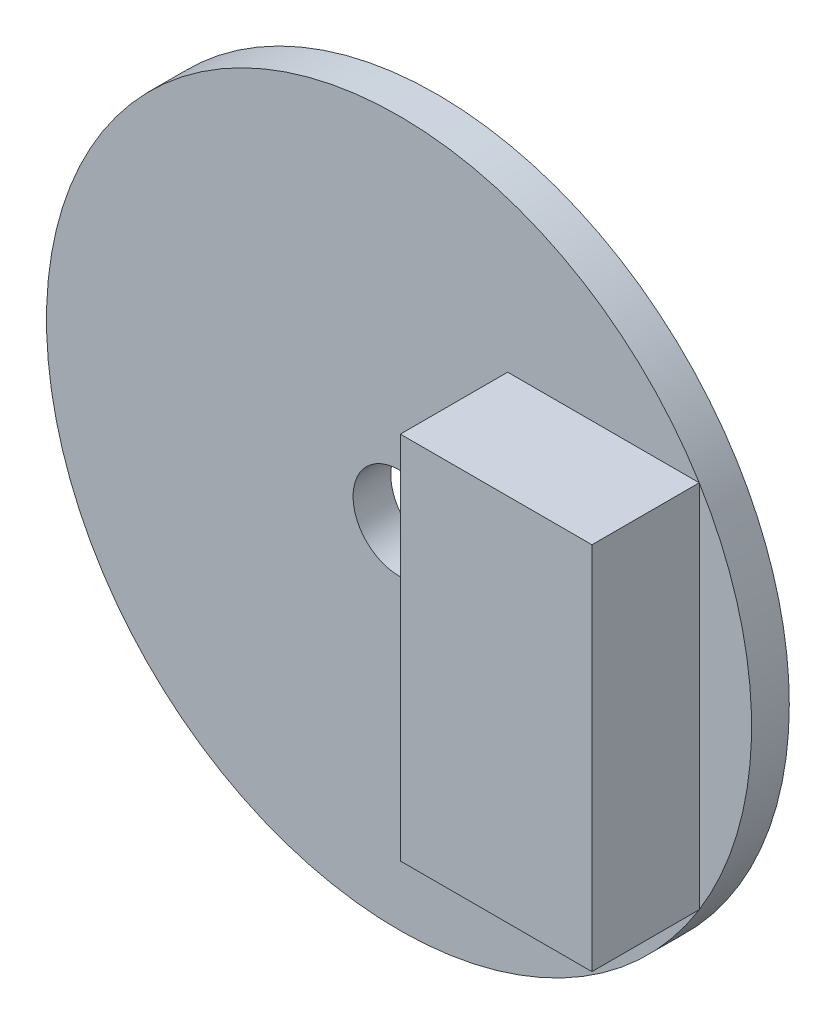
ISO-10303-21;
HEADER;
FILE_DESCRIPTION(('STEP AP214'),'2;1');
FILE_NAME('part.step','',(''),(''),'','','');
FILE_SCHEMA(('AUTOMOTIVE_DESIGN { 1 0 10303 214 1 1 1 1 }'));
ENDSEC;
DATA;
#1=APPLICATION_CONTEXT('core data for automotive mechanical design processes');
#2=APPLICATION_PROTOCOL_DEFINITION('international standard','automotive_design',2000,#1);
#3=PRODUCT_CONTEXT('',#1,'mechanical');
#4=PRODUCT('Part','Part','',(#3));
#5=PRODUCT_RELATED_PRODUCT_CATEGORY('part','',(#4));
#6=PRODUCT_DEFINITION_FORMATION('','',#4);
#7=PRODUCT_DEFINITION_CONTEXT('part definition',#1,'design');
#8=PRODUCT_DEFINITION('design','',#6,#7);
#9=PRODUCT_DEFINITION_SHAPE('','',#8);
#10=(LENGTH_UNIT() NAMED_UNIT(*) SI_UNIT(.MILLI.,.METRE.));
#11=(NAMED_UNIT(*) PLANE_ANGLE_UNIT() SI_UNIT($,.RADIAN.));
#12=(NAMED_UNIT(*) SI_UNIT($,.STERADIAN.) SOLID_ANGLE_UNIT());
#13=UNCERTAINTY_MEASURE_WITH_UNIT(LENGTH_MEASURE(1.E-05),#10,'distance_accuracy_value','');
#14=(GEOMETRIC_REPRESENTATION_CONTEXT(3) GLOBAL_UNCERTAINTY_ASSIGNED_CONTEXT((#13)) GLOBAL_UNIT_ASSIGNED_CONTEXT((#10,
#11,#12)) REPRESENTATION_CONTEXT('',''));
#15=CARTESIAN_POINT('',(0.,0.,0.));
#16=DIRECTION('',(0.,0.,1.));
#17=DIRECTION('',(1.,0.,0.));
#18=AXIS2_PLACEMENT_3D('',#15,#16,#17);
#19=CARTESIAN_POINT('',(0.,0.,1.23));
#20=DIRECTION('',(0.,0.,1.));
#21=DIRECTION('',(1.,0.,0.));
#22=AXIS2_PLACEMENT_3D('',#19,#20,#21);
#23=PLANE('',#22);
#24=DIRECTION('',(0.,1.,0.));
#25=VECTOR('',#24,1.);
#26=CARTESIAN_POINT('',(9.79248184895356,6.02970142195408,1.23));
#27=LINE('',#26,#25);
#28=CARTESIAN_POINT('',(9.79248184895356,-6.02970142195408,1.23));
#29=VERTEX_POINT('',#28);
#30=CARTESIAN_POINT('',(9.79248184895356,6.02970142195408,1.23));
#31=VERTEX_POINT('',#30);
#32=EDGE_CURVE('E54',#29,#31,#27,.T.);
#33=ORIENTED_EDGE('',*,*,#32,.F.);
#34=CARTESIAN_POINT('',(0.,0.,1.23));
#35=DIRECTION('',(0.,0.,1.));
#36=DIRECTION('',(1.,0.,0.));
#37=AXIS2_PLACEMENT_3D('',#34,#35,#36);
#38=CIRCLE('',#37,11.5);
#39=EDGE_CURVE('E41',#29,#31,#38,.T.);
#40=ORIENTED_EDGE('',*,*,#39,.T.);
#41=EDGE_LOOP('',(#33,#40));
#42=FACE_BOUND('',#41,.T.);
#43=ADVANCED_FACE('F32',(#42),#23,.T.);
#44=CARTESIAN_POINT('',(0.,0.,1.23));
#45=DIRECTION('',(0.,0.,-1.));
#46=DIRECTION('',(-1.,0.,0.));
#47=AXIS2_PLACEMENT_3D('',#44,#45,#46);
#48=CYLINDRICAL_SURFACE('',#47,11.5);
#49=EDGE_CURVE('E11',#31,#29,#38,.T.);
#50=ORIENTED_EDGE('',*,*,#49,.F.);
#51=ORIENTED_EDGE('',*,*,#39,.F.);
#52=EDGE_LOOP('',(#50,#51));
#53=FACE_BOUND('',#52,.T.);
#54=CARTESIAN_POINT('',(0.,0.,0.));
#55=DIRECTION('',(0.,0.,1.));
#56=DIRECTION('',(1.,0.,0.));
#57=AXIS2_PLACEMENT_3D('',#54,#55,#56);
#58=CIRCLE('',#57,11.5);
#59=CARTESIAN_POINT('',(11.5,0.,0.));
#60=VERTEX_POINT('',#59);
#61=EDGE_CURVE('E36',#60,#60,#58,.T.);
#62=ORIENTED_EDGE('',*,*,#61,.T.);
#63=EDGE_LOOP('',(#62));
#64=FACE_BOUND('',#63,.T.);
#65=ADVANCED_FACE('F34',(#53,#64),#48,.T.);
#66=CARTESIAN_POINT('',(0.,0.,1.23));
#67=DIRECTION('',(0.,0.,1.));
#68=DIRECTION('',(1.,0.,0.));
#69=AXIS2_PLACEMENT_3D('',#66,#67,#68);
#70=CIRCLE('',#69,1.5);
#71=CARTESIAN_POINT('',(1.5,0.,1.23));
#72=VERTEX_POINT('',#71);
#73=EDGE_CURVE('E115',#72,#72,#70,.T.);
#74=ORIENTED_EDGE('',*,*,#73,.F.);
#75=EDGE_LOOP('',(#74));
#76=FACE_BOUND('',#75,.T.);
#77=DIRECTION('',(1.,0.,0.));
#78=VECTOR('',#77,1.);
#79=CARTESIAN_POINT('',(9.79248184895356,-6.02970142195408,1.23));
#80=LINE('',#79,#78);
#81=CARTESIAN_POINT('',(3.54248184895356,-6.02970142195408,1.23));
#82=VERTEX_POINT('',#81);
#83=EDGE_CURVE('E47',#82,#29,#80,.T.);
#84=ORIENTED_EDGE('',*,*,#83,.F.);
#85=DIRECTION('',(0.,-1.,0.));
#86=VECTOR('',#85,1.);
#87=CARTESIAN_POINT('',(3.54248184895356,6.02970142195408,1.23));
#88=LINE('',#87,#86);
#89=CARTESIAN_POINT('',(3.54248184895356,6.02970142195408,1.23));
#90=VERTEX_POINT('',#89);
#91=EDGE_CURVE('E107',#90,#82,#88,.T.);
#92=ORIENTED_EDGE('',*,*,#91,.F.);
#93=DIRECTION('',(-1.,0.,0.));
#94=VECTOR('',#93,1.);
#95=CARTESIAN_POINT('',(9.79248184895356,6.02970142195408,1.23));
#96=LINE('',#95,#94);
#97=EDGE_CURVE('E109',#31,#90,#96,.T.);
#98=ORIENTED_EDGE('',*,*,#97,.F.);
#99=ORIENTED_EDGE('',*,*,#49,.T.);
#100=EDGE_LOOP('',(#84,#92,#98,#99));
#101=FACE_BOUND('',#100,.T.);
#102=ADVANCED_FACE('F130',(#76,#101),#23,.T.);
#103=CARTESIAN_POINT('',(0.,0.,0.));
#104=DIRECTION('',(0.,0.,1.));
#105=DIRECTION('',(1.,0.,0.));
#106=AXIS2_PLACEMENT_3D('',#103,#104,#105);
#107=PLANE('',#106);
#108=CARTESIAN_POINT('',(0.,0.,0.));
#109=DIRECTION('',(0.,0.,1.));
#110=DIRECTION('',(1.,0.,0.));
#111=AXIS2_PLACEMENT_3D('',#108,#109,#110);
#112=CIRCLE('',#111,1.5);
#113=CARTESIAN_POINT('',(1.5,0.,0.));
#114=VERTEX_POINT('',#113);
#115=EDGE_CURVE('E112',#114,#114,#112,.T.);
#116=ORIENTED_EDGE('',*,*,#115,.T.);
#117=EDGE_LOOP('',(#116));
#118=FACE_BOUND('',#117,.T.);
#119=ORIENTED_EDGE('',*,*,#61,.F.);
#120=EDGE_LOOP('',(#119));
#121=FACE_BOUND('',#120,.T.);
#122=ADVANCED_FACE('F121',(#118,#121),#107,.F.);
#123=CARTESIAN_POINT('',(9.79248184895356,6.02970142195408,4.73));
#124=DIRECTION('',(-1.,0.,0.));
#125=DIRECTION('',(0.,0.,1.));
#126=AXIS2_PLACEMENT_3D('',#123,#124,#125);
#127=PLANE('',#126);
#128=ORIENTED_EDGE('',*,*,#32,.T.);
#129=DIRECTION('',(0.,0.,-1.));
#130=VECTOR('',#129,1.);
#131=CARTESIAN_POINT('',(9.79248184895356,6.02970142195408,4.73));
#132=LINE('',#131,#130);
#133=CARTESIAN_POINT('',(9.79248184895356,6.02970142195408,4.73));
#134=VERTEX_POINT('',#133);
#135=EDGE_CURVE('E80',#134,#31,#132,.T.);
#136=ORIENTED_EDGE('',*,*,#135,.F.);
#137=DIRECTION('',(0.,1.,0.));
#138=VECTOR('',#137,1.);
#139=CARTESIAN_POINT('',(9.79248184895356,6.02970142195408,4.73));
#140=LINE('',#139,#138);
#141=CARTESIAN_POINT('',(9.79248184895356,-6.02970142195408,4.73));
#142=VERTEX_POINT('',#141);
#143=EDGE_CURVE('E86',#142,#134,#140,.T.);
#144=ORIENTED_EDGE('',*,*,#143,.F.);
#145=DIRECTION('',(0.,0.,-1.));
#146=VECTOR('',#145,1.);
#147=CARTESIAN_POINT('',(9.79248184895356,-6.02970142195408,4.73));
#148=LINE('',#147,#146);
#149=EDGE_CURVE('E104',#142,#29,#148,.T.);
#150=ORIENTED_EDGE('',*,*,#149,.T.);
#151=EDGE_LOOP('',(#128,#136,#144,#150));
#152=FACE_BOUND('',#151,.T.);
#153=ADVANCED_FACE('F96',(#152),#127,.F.);
#154=CARTESIAN_POINT('',(9.79248184895356,6.02970142195408,4.73));
#155=DIRECTION('',(0.,-1.,0.));
#156=DIRECTION('',(1.,0.,0.));
#157=AXIS2_PLACEMENT_3D('',#154,#155,#156);
#158=PLANE('',#157);
#159=ORIENTED_EDGE('',*,*,#97,.T.);
#160=DIRECTION('',(0.,0.,-1.));
#161=VECTOR('',#160,1.);
#162=CARTESIAN_POINT('',(3.54248184895356,6.02970142195408,4.73));
#163=LINE('',#162,#161);
#164=CARTESIAN_POINT('',(3.54248184895356,6.02970142195408,4.73));
#165=VERTEX_POINT('',#164);
#166=EDGE_CURVE('E82',#165,#90,#163,.T.);
#167=ORIENTED_EDGE('',*,*,#166,.F.);
#168=DIRECTION('',(-1.,0.,0.));
#169=VECTOR('',#168,1.);
#170=CARTESIAN_POINT('',(9.79248184895356,6.02970142195408,4.73));
#171=LINE('',#170,#169);
#172=EDGE_CURVE('E75',#134,#165,#171,.T.);
#173=ORIENTED_EDGE('',*,*,#172,.F.);
#174=ORIENTED_EDGE('',*,*,#135,.T.);
#175=EDGE_LOOP('',(#159,#167,#173,#174));
#176=FACE_BOUND('',#175,.T.);
#177=ADVANCED_FACE('F78',(#176),#158,.F.);
#178=CARTESIAN_POINT('',(3.54248184895356,6.02970142195408,4.73));
#179=DIRECTION('',(1.,0.,0.));
#180=DIRECTION('',(0.,0.,-1.));
#181=AXIS2_PLACEMENT_3D('',#178,#179,#180);
#182=PLANE('',#181);
#183=ORIENTED_EDGE('',*,*,#91,.T.);
#184=DIRECTION('',(0.,0.,-1.));
#185=VECTOR('',#184,1.);
#186=CARTESIAN_POINT('',(3.54248184895356,-6.02970142195408,4.73));
#187=LINE('',#186,#185);
#188=CARTESIAN_POINT('',(3.54248184895356,-6.02970142195408,4.73));
#189=VERTEX_POINT('',#188);
#190=EDGE_CURVE('E99',#189,#82,#187,.T.);
#191=ORIENTED_EDGE('',*,*,#190,.F.);
#192=DIRECTION('',(0.,-1.,0.));
#193=VECTOR('',#192,1.);
#194=CARTESIAN_POINT('',(3.54248184895356,6.02970142195408,4.73));
#195=LINE('',#194,#193);
#196=EDGE_CURVE('E85',#165,#189,#195,.T.);
#197=ORIENTED_EDGE('',*,*,#196,.F.);
#198=ORIENTED_EDGE('',*,*,#166,.T.);
#199=EDGE_LOOP('',(#183,#191,#197,#198));
#200=FACE_BOUND('',#199,.T.);
#201=ADVANCED_FACE('F163',(#200),#182,.F.);
#202=CARTESIAN_POINT('',(9.79248184895356,-6.02970142195408,4.73));
#203=DIRECTION('',(0.,1.,0.));
#204=DIRECTION('',(-1.,0.,0.));
#205=AXIS2_PLACEMENT_3D('',#202,#203,#204);
#206=PLANE('',#205);
#207=ORIENTED_EDGE('',*,*,#83,.T.);
#208=ORIENTED_EDGE('',*,*,#149,.F.);
#209=DIRECTION('',(1.,0.,0.));
#210=VECTOR('',#209,1.);
#211=CARTESIAN_POINT('',(9.79248184895356,-6.02970142195408,4.73));
#212=LINE('',#211,#210);
#213=EDGE_CURVE('E91',#189,#142,#212,.T.);
#214=ORIENTED_EDGE('',*,*,#213,.F.);
#215=ORIENTED_EDGE('',*,*,#190,.T.);
#216=EDGE_LOOP('',(#207,#208,#214,#215));
#217=FACE_BOUND('',#216,.T.);
#218=ADVANCED_FACE('F172',(#217),#206,.F.);
#219=CARTESIAN_POINT('',(0.,0.,4.73));
#220=DIRECTION('',(0.,0.,-1.));
#221=DIRECTION('',(-1.,0.,0.));
#222=AXIS2_PLACEMENT_3D('',#219,#220,#221);
#223=PLANE('',#222);
#224=ORIENTED_EDGE('',*,*,#143,.T.);
#225=ORIENTED_EDGE('',*,*,#172,.T.);
#226=ORIENTED_EDGE('',*,*,#196,.T.);
#227=ORIENTED_EDGE('',*,*,#213,.T.);
#228=EDGE_LOOP('',(#224,#225,#226,#227));
#229=FACE_BOUND('',#228,.T.);
#230=ADVANCED_FACE('F89',(#229),#223,.F.);
#231=CARTESIAN_POINT('',(0.,0.,0.));
#232=DIRECTION('',(0.,0.,1.));
#233=DIRECTION('',(1.,0.,0.));
#234=AXIS2_PLACEMENT_3D('',#231,#232,#233);
#235=CYLINDRICAL_SURFACE('',#234,1.5);
#236=ORIENTED_EDGE('',*,*,#115,.F.);
#237=EDGE_LOOP('',(#236));
#238=FACE_BOUND('',#237,.T.);
#239=ORIENTED_EDGE('',*,*,#73,.T.);
#240=EDGE_LOOP('',(#239));
#241=FACE_BOUND('',#240,.T.);
#242=ADVANCED_FACE('F124',(#238,#241),#235,.F.);
#243=CLOSED_SHELL('',(#43,#65,#102,#122,#153,#177,#201,#218,#230,#242));
#244=MANIFOLD_SOLID_BREP('B2',#243);
#245=ADVANCED_BREP_SHAPE_REPRESENTATION('',(#18,#244),#14);
#246=SHAPE_DEFINITION_REPRESENTATION(#9,#245);
ENDSEC;
END-ISO-10303-21;
